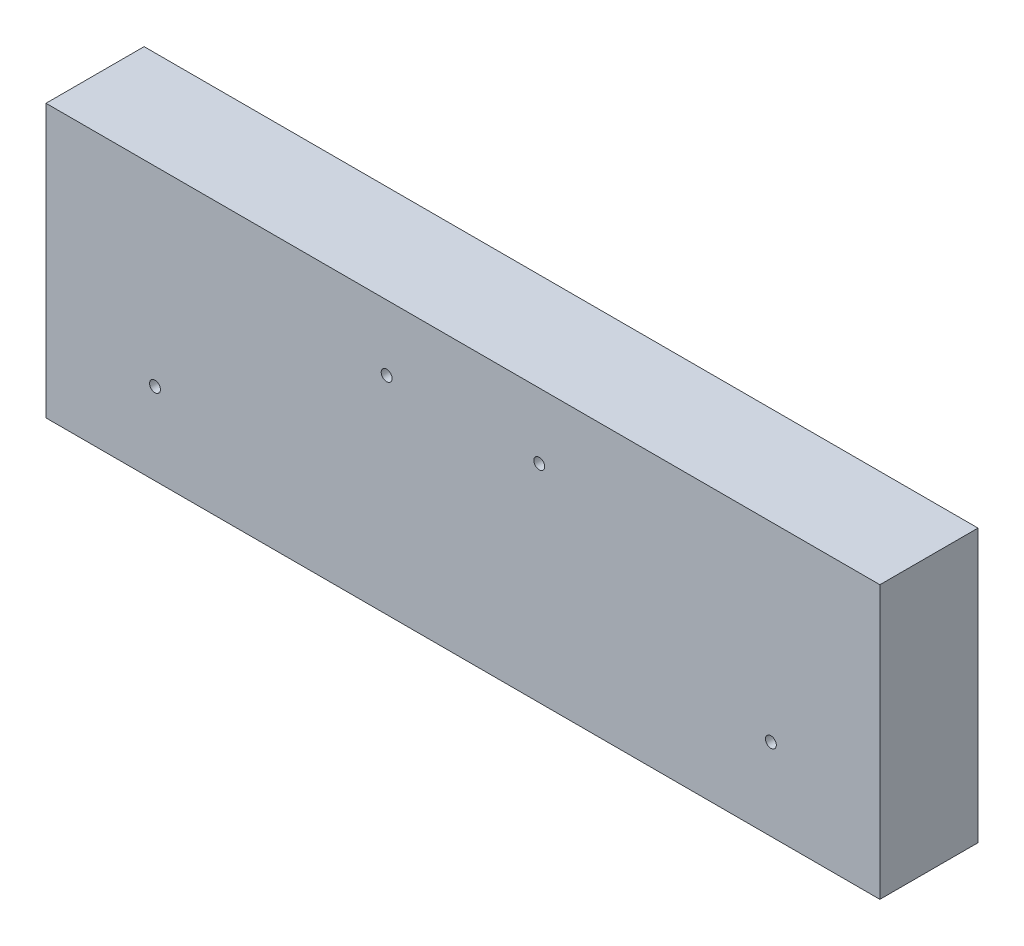
ISO-10303-21;
HEADER;
FILE_DESCRIPTION(('STEP AP214'),'2;1');
FILE_NAME('part.step','',(''),(''),'','','');
FILE_SCHEMA(('AUTOMOTIVE_DESIGN { 1 0 10303 214 1 1 1 1 }'));
ENDSEC;
DATA;
#1=APPLICATION_CONTEXT('core data for automotive mechanical design processes');
#2=APPLICATION_PROTOCOL_DEFINITION('international standard','automotive_design',2000,#1);
#3=PRODUCT_CONTEXT('',#1,'mechanical');
#4=PRODUCT('Part','Part','',(#3));
#5=PRODUCT_RELATED_PRODUCT_CATEGORY('part','',(#4));
#6=PRODUCT_DEFINITION_FORMATION('','',#4);
#7=PRODUCT_DEFINITION_CONTEXT('part definition',#1,'design');
#8=PRODUCT_DEFINITION('design','',#6,#7);
#9=PRODUCT_DEFINITION_SHAPE('','',#8);
#10=(LENGTH_UNIT() NAMED_UNIT(*) SI_UNIT(.MILLI.,.METRE.));
#11=(NAMED_UNIT(*) PLANE_ANGLE_UNIT() SI_UNIT($,.RADIAN.));
#12=(NAMED_UNIT(*) SI_UNIT($,.STERADIAN.) SOLID_ANGLE_UNIT());
#13=UNCERTAINTY_MEASURE_WITH_UNIT(LENGTH_MEASURE(1.E-05),#10,'distance_accuracy_value','');
#14=(GEOMETRIC_REPRESENTATION_CONTEXT(3) GLOBAL_UNCERTAINTY_ASSIGNED_CONTEXT((#13)) GLOBAL_UNIT_ASSIGNED_CONTEXT((#10,
#11,#12)) REPRESENTATION_CONTEXT('',''));
#15=CARTESIAN_POINT('',(0.,0.,0.));
#16=DIRECTION('',(0.,0.,1.));
#17=DIRECTION('',(1.,0.,0.));
#18=AXIS2_PLACEMENT_3D('',#15,#16,#17);
#19=CARTESIAN_POINT('',(0.,0.,18.));
#20=DIRECTION('',(0.,0.,1.));
#21=DIRECTION('',(1.,0.,0.));
#22=AXIS2_PLACEMENT_3D('',#19,#20,#21);
#23=PLANE('',#22);
#24=CARTESIAN_POINT('',(-56.5,-10.,18.));
#25=DIRECTION('',(0.,0.,1.));
#26=DIRECTION('',(1.,0.,0.));
#27=AXIS2_PLACEMENT_3D('',#24,#25,#26);
#28=CIRCLE('',#27,0.999999999999998);
#29=CARTESIAN_POINT('',(-55.5,-10.,18.));
#30=VERTEX_POINT('',#29);
#31=EDGE_CURVE('E120',#30,#30,#28,.T.);
#32=ORIENTED_EDGE('',*,*,#31,.F.);
#33=EDGE_LOOP('',(#32));
#34=FACE_BOUND('',#33,.T.);
#35=CARTESIAN_POINT('',(-14.,13.,18.));
#36=DIRECTION('',(0.,0.,1.));
#37=DIRECTION('',(1.,0.,0.));
#38=AXIS2_PLACEMENT_3D('',#35,#36,#37);
#39=CIRCLE('',#38,1.);
#40=CARTESIAN_POINT('',(-13.,13.,18.));
#41=VERTEX_POINT('',#40);
#42=EDGE_CURVE('E99',#41,#41,#39,.T.);
#43=ORIENTED_EDGE('',*,*,#42,.F.);
#44=EDGE_LOOP('',(#43));
#45=FACE_BOUND('',#44,.T.);
#46=DIRECTION('',(0.,-1.,0.));
#47=VECTOR('',#46,1.);
#48=CARTESIAN_POINT('',(-76.5,25.,18.));
#49=LINE('',#48,#47);
#50=CARTESIAN_POINT('',(-76.5,25.,18.));
#51=VERTEX_POINT('',#50);
#52=CARTESIAN_POINT('',(-76.5,-25.,18.));
#53=VERTEX_POINT('',#52);
#54=EDGE_CURVE('E84',#51,#53,#49,.T.);
#55=ORIENTED_EDGE('',*,*,#54,.T.);
#56=DIRECTION('',(1.,0.,0.));
#57=VECTOR('',#56,1.);
#58=CARTESIAN_POINT('',(-76.5,-25.,18.));
#59=LINE('',#58,#57);
#60=CARTESIAN_POINT('',(76.5,-25.,18.));
#61=VERTEX_POINT('',#60);
#62=EDGE_CURVE('E79',#53,#61,#59,.T.);
#63=ORIENTED_EDGE('',*,*,#62,.T.);
#64=DIRECTION('',(0.,1.,0.));
#65=VECTOR('',#64,1.);
#66=CARTESIAN_POINT('',(76.5,25.,18.));
#67=LINE('',#66,#65);
#68=CARTESIAN_POINT('',(76.5,25.,18.));
#69=VERTEX_POINT('',#68);
#70=EDGE_CURVE('E82',#61,#69,#67,.T.);
#71=ORIENTED_EDGE('',*,*,#70,.T.);
#72=DIRECTION('',(-1.,0.,0.));
#73=VECTOR('',#72,1.);
#74=CARTESIAN_POINT('',(-76.5,25.,18.));
#75=LINE('',#74,#73);
#76=EDGE_CURVE('E49',#69,#51,#75,.T.);
#77=ORIENTED_EDGE('',*,*,#76,.T.);
#78=EDGE_LOOP('',(#55,#63,#71,#77));
#79=FACE_BOUND('',#78,.T.);
#80=CARTESIAN_POINT('',(14.,13.,18.));
#81=DIRECTION('',(0.,0.,1.));
#82=DIRECTION('',(-1.,0.,0.));
#83=AXIS2_PLACEMENT_3D('',#80,#81,#82);
#84=CIRCLE('',#83,1.);
#85=CARTESIAN_POINT('',(13.,13.,18.));
#86=VERTEX_POINT('',#85);
#87=EDGE_CURVE('E114',#86,#86,#84,.T.);
#88=ORIENTED_EDGE('',*,*,#87,.F.);
#89=EDGE_LOOP('',(#88));
#90=FACE_BOUND('',#89,.T.);
#91=CARTESIAN_POINT('',(56.5,-10.,18.));
#92=DIRECTION('',(0.,0.,1.));
#93=DIRECTION('',(1.,0.,0.));
#94=AXIS2_PLACEMENT_3D('',#91,#92,#93);
#95=CIRCLE('',#94,0.999999999999998);
#96=CARTESIAN_POINT('',(57.5,-10.,18.));
#97=VERTEX_POINT('',#96);
#98=EDGE_CURVE('E126',#97,#97,#95,.T.);
#99=ORIENTED_EDGE('',*,*,#98,.F.);
#100=EDGE_LOOP('',(#99));
#101=FACE_BOUND('',#100,.T.);
#102=ADVANCED_FACE('F32',(#34,#45,#79,#90,#101),#23,.T.);
#103=CARTESIAN_POINT('',(0.,0.,0.));
#104=DIRECTION('',(0.,0.,1.));
#105=DIRECTION('',(1.,0.,0.));
#106=AXIS2_PLACEMENT_3D('',#103,#104,#105);
#107=PLANE('',#106);
#108=CARTESIAN_POINT('',(-56.5,-10.,0.));
#109=DIRECTION('',(0.,0.,1.));
#110=DIRECTION('',(1.,0.,0.));
#111=AXIS2_PLACEMENT_3D('',#108,#109,#110);
#112=CIRCLE('',#111,0.999999999999998);
#113=CARTESIAN_POINT('',(-55.5,-10.,0.));
#114=VERTEX_POINT('',#113);
#115=EDGE_CURVE('E123',#114,#114,#112,.T.);
#116=ORIENTED_EDGE('',*,*,#115,.T.);
#117=EDGE_LOOP('',(#116));
#118=FACE_BOUND('',#117,.T.);
#119=CARTESIAN_POINT('',(-14.,13.,0.));
#120=DIRECTION('',(0.,0.,1.));
#121=DIRECTION('',(1.,0.,0.));
#122=AXIS2_PLACEMENT_3D('',#119,#120,#121);
#123=CIRCLE('',#122,1.);
#124=CARTESIAN_POINT('',(-13.,13.,0.));
#125=VERTEX_POINT('',#124);
#126=EDGE_CURVE('E111',#125,#125,#123,.T.);
#127=ORIENTED_EDGE('',*,*,#126,.T.);
#128=EDGE_LOOP('',(#127));
#129=FACE_BOUND('',#128,.T.);
#130=DIRECTION('',(0.,-1.,0.));
#131=VECTOR('',#130,1.);
#132=CARTESIAN_POINT('',(-76.5,25.,0.));
#133=LINE('',#132,#131);
#134=CARTESIAN_POINT('',(-76.5,25.,0.));
#135=VERTEX_POINT('',#134);
#136=CARTESIAN_POINT('',(-76.5,-25.,0.));
#137=VERTEX_POINT('',#136);
#138=EDGE_CURVE('E96',#135,#137,#133,.T.);
#139=ORIENTED_EDGE('',*,*,#138,.F.);
#140=DIRECTION('',(-1.,0.,0.));
#141=VECTOR('',#140,1.);
#142=CARTESIAN_POINT('',(-76.5,25.,0.));
#143=LINE('',#142,#141);
#144=CARTESIAN_POINT('',(76.5,25.,0.));
#145=VERTEX_POINT('',#144);
#146=EDGE_CURVE('E72',#145,#135,#143,.T.);
#147=ORIENTED_EDGE('',*,*,#146,.F.);
#148=DIRECTION('',(0.,1.,0.));
#149=VECTOR('',#148,1.);
#150=CARTESIAN_POINT('',(76.5,25.,0.));
#151=LINE('',#150,#149);
#152=CARTESIAN_POINT('',(76.5,-25.,0.));
#153=VERTEX_POINT('',#152);
#154=EDGE_CURVE('E66',#153,#145,#151,.T.);
#155=ORIENTED_EDGE('',*,*,#154,.F.);
#156=DIRECTION('',(1.,0.,0.));
#157=VECTOR('',#156,1.);
#158=CARTESIAN_POINT('',(-76.5,-25.,0.));
#159=LINE('',#158,#157);
#160=EDGE_CURVE('E88',#137,#153,#159,.T.);
#161=ORIENTED_EDGE('',*,*,#160,.F.);
#162=EDGE_LOOP('',(#139,#147,#155,#161));
#163=FACE_BOUND('',#162,.T.);
#164=CARTESIAN_POINT('',(14.,13.,0.));
#165=DIRECTION('',(0.,0.,1.));
#166=DIRECTION('',(-1.,0.,0.));
#167=AXIS2_PLACEMENT_3D('',#164,#165,#166);
#168=CIRCLE('',#167,1.);
#169=CARTESIAN_POINT('',(13.,13.,0.));
#170=VERTEX_POINT('',#169);
#171=EDGE_CURVE('E117',#170,#170,#168,.T.);
#172=ORIENTED_EDGE('',*,*,#171,.T.);
#173=EDGE_LOOP('',(#172));
#174=FACE_BOUND('',#173,.T.);
#175=CARTESIAN_POINT('',(56.5,-10.,0.));
#176=DIRECTION('',(0.,0.,1.));
#177=DIRECTION('',(1.,0.,0.));
#178=AXIS2_PLACEMENT_3D('',#175,#176,#177);
#179=CIRCLE('',#178,0.999999999999998);
#180=CARTESIAN_POINT('',(57.5,-10.,0.));
#181=VERTEX_POINT('',#180);
#182=EDGE_CURVE('E129',#181,#181,#179,.T.);
#183=ORIENTED_EDGE('',*,*,#182,.T.);
#184=EDGE_LOOP('',(#183));
#185=FACE_BOUND('',#184,.T.);
#186=ADVANCED_FACE('F107',(#118,#129,#163,#174,#185),#107,.F.);
#187=CARTESIAN_POINT('',(-76.5,25.,18.));
#188=DIRECTION('',(1.,0.,0.));
#189=DIRECTION('',(0.,1.,0.));
#190=AXIS2_PLACEMENT_3D('',#187,#188,#189);
#191=PLANE('',#190);
#192=ORIENTED_EDGE('',*,*,#138,.T.);
#193=DIRECTION('',(0.,0.,-1.));
#194=VECTOR('',#193,1.);
#195=CARTESIAN_POINT('',(-76.5,-25.,18.));
#196=LINE('',#195,#194);
#197=EDGE_CURVE('E11',#53,#137,#196,.T.);
#198=ORIENTED_EDGE('',*,*,#197,.F.);
#199=ORIENTED_EDGE('',*,*,#54,.F.);
#200=DIRECTION('',(0.,0.,-1.));
#201=VECTOR('',#200,1.);
#202=CARTESIAN_POINT('',(-76.5,25.,18.));
#203=LINE('',#202,#201);
#204=EDGE_CURVE('E92',#51,#135,#203,.T.);
#205=ORIENTED_EDGE('',*,*,#204,.T.);
#206=EDGE_LOOP('',(#192,#198,#199,#205));
#207=FACE_BOUND('',#206,.T.);
#208=ADVANCED_FACE('F34',(#207),#191,.F.);
#209=CARTESIAN_POINT('',(-76.5,-25.,18.));
#210=DIRECTION('',(0.,1.,0.));
#211=DIRECTION('',(-1.,0.,0.));
#212=AXIS2_PLACEMENT_3D('',#209,#210,#211);
#213=PLANE('',#212);
#214=ORIENTED_EDGE('',*,*,#160,.T.);
#215=DIRECTION('',(0.,0.,-1.));
#216=VECTOR('',#215,1.);
#217=CARTESIAN_POINT('',(76.5,-25.,18.));
#218=LINE('',#217,#216);
#219=EDGE_CURVE('E41',#61,#153,#218,.T.);
#220=ORIENTED_EDGE('',*,*,#219,.F.);
#221=ORIENTED_EDGE('',*,*,#62,.F.);
#222=ORIENTED_EDGE('',*,*,#197,.T.);
#223=EDGE_LOOP('',(#214,#220,#221,#222));
#224=FACE_BOUND('',#223,.T.);
#225=ADVANCED_FACE('F87',(#224),#213,.F.);
#226=CARTESIAN_POINT('',(76.5,25.,18.));
#227=DIRECTION('',(-1.,0.,0.));
#228=DIRECTION('',(0.,0.,1.));
#229=AXIS2_PLACEMENT_3D('',#226,#227,#228);
#230=PLANE('',#229);
#231=ORIENTED_EDGE('',*,*,#154,.T.);
#232=DIRECTION('',(0.,0.,-1.));
#233=VECTOR('',#232,1.);
#234=CARTESIAN_POINT('',(76.5,25.,18.));
#235=LINE('',#234,#233);
#236=EDGE_CURVE('E89',#69,#145,#235,.T.);
#237=ORIENTED_EDGE('',*,*,#236,.F.);
#238=ORIENTED_EDGE('',*,*,#70,.F.);
#239=ORIENTED_EDGE('',*,*,#219,.T.);
#240=EDGE_LOOP('',(#231,#237,#238,#239));
#241=FACE_BOUND('',#240,.T.);
#242=ADVANCED_FACE('F90',(#241),#230,.F.);
#243=CARTESIAN_POINT('',(-76.5,25.,18.));
#244=DIRECTION('',(0.,-1.,0.));
#245=DIRECTION('',(1.,0.,0.));
#246=AXIS2_PLACEMENT_3D('',#243,#244,#245);
#247=PLANE('',#246);
#248=ORIENTED_EDGE('',*,*,#146,.T.);
#249=ORIENTED_EDGE('',*,*,#204,.F.);
#250=ORIENTED_EDGE('',*,*,#76,.F.);
#251=ORIENTED_EDGE('',*,*,#236,.T.);
#252=EDGE_LOOP('',(#248,#249,#250,#251));
#253=FACE_BOUND('',#252,.T.);
#254=ADVANCED_FACE('F104',(#253),#247,.F.);
#255=CARTESIAN_POINT('',(-14.,13.,18.));
#256=DIRECTION('',(0.,0.,-1.));
#257=DIRECTION('',(-1.,0.,0.));
#258=AXIS2_PLACEMENT_3D('',#255,#256,#257);
#259=CYLINDRICAL_SURFACE('',#258,1.);
#260=ORIENTED_EDGE('',*,*,#42,.T.);
#261=EDGE_LOOP('',(#260));
#262=FACE_BOUND('',#261,.T.);
#263=ORIENTED_EDGE('',*,*,#126,.F.);
#264=EDGE_LOOP('',(#263));
#265=FACE_BOUND('',#264,.T.);
#266=ADVANCED_FACE('F149',(#262,#265),#259,.F.);
#267=CARTESIAN_POINT('',(14.,13.,18.));
#268=DIRECTION('',(0.,0.,-1.));
#269=DIRECTION('',(-1.,0.,0.));
#270=AXIS2_PLACEMENT_3D('',#267,#268,#269);
#271=CYLINDRICAL_SURFACE('',#270,1.);
#272=ORIENTED_EDGE('',*,*,#87,.T.);
#273=EDGE_LOOP('',(#272));
#274=FACE_BOUND('',#273,.T.);
#275=ORIENTED_EDGE('',*,*,#171,.F.);
#276=EDGE_LOOP('',(#275));
#277=FACE_BOUND('',#276,.T.);
#278=ADVANCED_FACE('F195',(#274,#277),#271,.F.);
#279=CARTESIAN_POINT('',(-56.5,-10.,18.));
#280=DIRECTION('',(0.,0.,-1.));
#281=DIRECTION('',(-1.,0.,0.));
#282=AXIS2_PLACEMENT_3D('',#279,#280,#281);
#283=CYLINDRICAL_SURFACE('',#282,0.999999999999998);
#284=ORIENTED_EDGE('',*,*,#31,.T.);
#285=EDGE_LOOP('',(#284));
#286=FACE_BOUND('',#285,.T.);
#287=ORIENTED_EDGE('',*,*,#115,.F.);
#288=EDGE_LOOP('',(#287));
#289=FACE_BOUND('',#288,.T.);
#290=ADVANCED_FACE('F203',(#286,#289),#283,.F.);
#291=CARTESIAN_POINT('',(56.5,-10.,18.));
#292=DIRECTION('',(0.,0.,-1.));
#293=DIRECTION('',(-1.,0.,0.));
#294=AXIS2_PLACEMENT_3D('',#291,#292,#293);
#295=CYLINDRICAL_SURFACE('',#294,0.999999999999998);
#296=ORIENTED_EDGE('',*,*,#98,.T.);
#297=EDGE_LOOP('',(#296));
#298=FACE_BOUND('',#297,.T.);
#299=ORIENTED_EDGE('',*,*,#182,.F.);
#300=EDGE_LOOP('',(#299));
#301=FACE_BOUND('',#300,.T.);
#302=ADVANCED_FACE('F135',(#298,#301),#295,.F.);
#303=CLOSED_SHELL('',(#102,#186,#208,#225,#242,#254,#266,#278,#290,#302));
#304=MANIFOLD_SOLID_BREP('B2',#303);
#305=ADVANCED_BREP_SHAPE_REPRESENTATION('',(#18,#304),#14);
#306=SHAPE_DEFINITION_REPRESENTATION(#9,#305);
ENDSEC;
END-ISO-10303-21;
